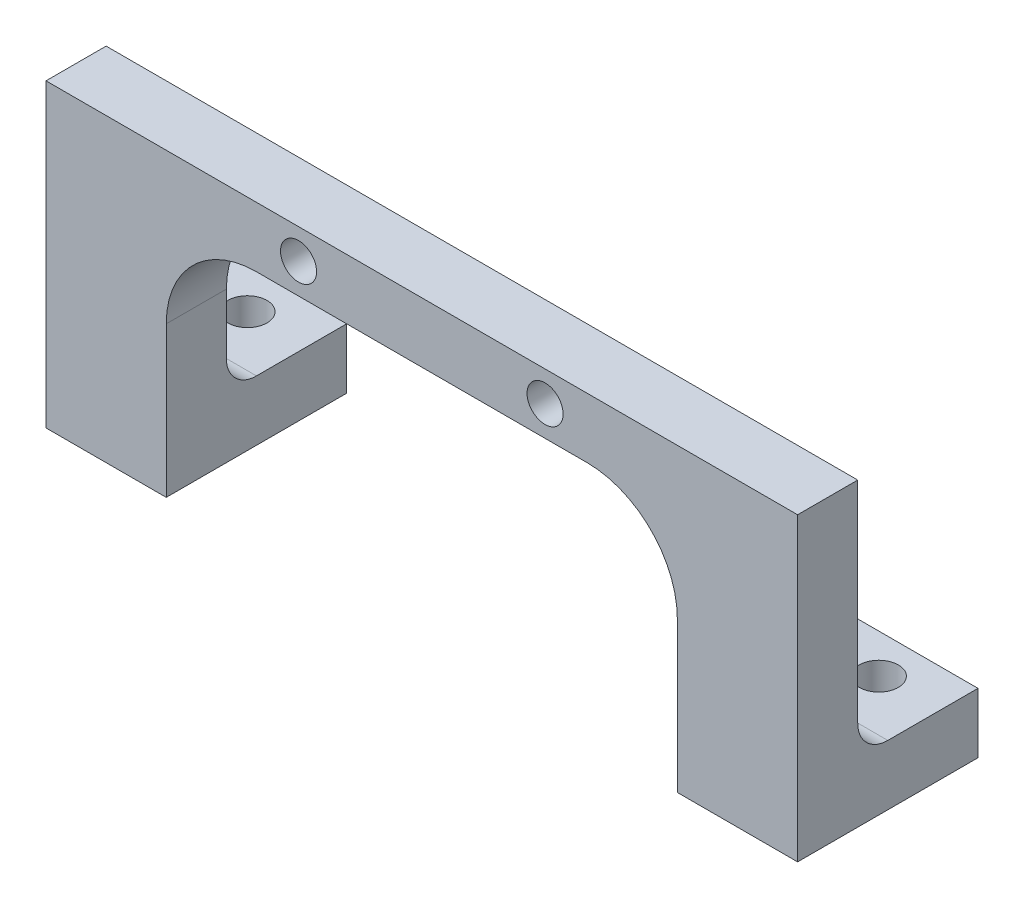
ISO-10303-21;
HEADER;
FILE_DESCRIPTION(('STEP AP214'),'2;1');
FILE_NAME('part.step','',(''),(''),'','','');
FILE_SCHEMA(('AUTOMOTIVE_DESIGN { 1 0 10303 214 1 1 1 1 }'));
ENDSEC;
DATA;
#1=APPLICATION_CONTEXT('core data for automotive mechanical design processes');
#2=APPLICATION_PROTOCOL_DEFINITION('international standard','automotive_design',2000,#1);
#3=PRODUCT_CONTEXT('',#1,'mechanical');
#4=PRODUCT('Part','Part','',(#3));
#5=PRODUCT_RELATED_PRODUCT_CATEGORY('part','',(#4));
#6=PRODUCT_DEFINITION_FORMATION('','',#4);
#7=PRODUCT_DEFINITION_CONTEXT('part definition',#1,'design');
#8=PRODUCT_DEFINITION('design','',#6,#7);
#9=PRODUCT_DEFINITION_SHAPE('','',#8);
#10=(LENGTH_UNIT() NAMED_UNIT(*) SI_UNIT(.MILLI.,.METRE.));
#11=(NAMED_UNIT(*) PLANE_ANGLE_UNIT() SI_UNIT($,.RADIAN.));
#12=(NAMED_UNIT(*) SI_UNIT($,.STERADIAN.) SOLID_ANGLE_UNIT());
#13=UNCERTAINTY_MEASURE_WITH_UNIT(LENGTH_MEASURE(1.E-05),#10,'distance_accuracy_value','');
#14=(GEOMETRIC_REPRESENTATION_CONTEXT(3) GLOBAL_UNCERTAINTY_ASSIGNED_CONTEXT((#13)) GLOBAL_UNIT_ASSIGNED_CONTEXT((#10,
#11,#12)) REPRESENTATION_CONTEXT('',''));
#15=CARTESIAN_POINT('',(0.,0.,0.));
#16=DIRECTION('',(0.,0.,1.));
#17=DIRECTION('',(1.,0.,0.));
#18=AXIS2_PLACEMENT_3D('',#15,#16,#17);
#19=CARTESIAN_POINT('',(63.5,-7.62,0.));
#20=DIRECTION('',(0.,1.,0.));
#21=DIRECTION('',(0.,0.,1.));
#22=AXIS2_PLACEMENT_3D('',#19,#20,#21);
#23=PLANE('',#22);
#24=CARTESIAN_POINT('',(58.42,-7.62,-11.5876551724138));
#25=DIRECTION('',(0.,1.,0.));
#26=DIRECTION('',(0.,0.,1.));
#27=AXIS2_PLACEMENT_3D('',#24,#25,#26);
#28=CIRCLE('',#27,1.651);
#29=CARTESIAN_POINT('',(58.42,-7.62,-9.93665517241378));
#30=VERTEX_POINT('',#29);
#31=EDGE_CURVE('E220',#30,#30,#28,.T.);
#32=ORIENTED_EDGE('',*,*,#31,.F.);
#33=EDGE_LOOP('',(#32));
#34=FACE_BOUND('',#33,.T.);
#35=DIRECTION('',(0.,0.,-1.));
#36=VECTOR('',#35,1.);
#37=CARTESIAN_POINT('',(53.34,-7.62,0.));
#38=LINE('',#37,#36);
#39=CARTESIAN_POINT('',(53.34,-7.62,-7.26965517241378));
#40=VERTEX_POINT('',#39);
#41=CARTESIAN_POINT('',(53.34,-7.62,-14.8896551724138));
#42=VERTEX_POINT('',#41);
#43=EDGE_CURVE('E222',#40,#42,#38,.T.);
#44=ORIENTED_EDGE('',*,*,#43,.F.);
#45=DIRECTION('',(-1.,0.,0.));
#46=VECTOR('',#45,1.);
#47=CARTESIAN_POINT('',(63.5,-7.62,-7.26965517241378));
#48=LINE('',#47,#46);
#49=CARTESIAN_POINT('',(63.5,-7.62,-7.26965517241378));
#50=VERTEX_POINT('',#49);
#51=EDGE_CURVE('E47',#50,#40,#48,.T.);
#52=ORIENTED_EDGE('',*,*,#51,.F.);
#53=DIRECTION('',(0.,0.,-1.));
#54=VECTOR('',#53,1.);
#55=CARTESIAN_POINT('',(63.5,-7.62,0.));
#56=LINE('',#55,#54);
#57=CARTESIAN_POINT('',(63.5,-7.62,-14.8896551724138));
#58=VERTEX_POINT('',#57);
#59=EDGE_CURVE('E168',#50,#58,#56,.T.);
#60=ORIENTED_EDGE('',*,*,#59,.T.);
#61=DIRECTION('',(-1.,0.,0.));
#62=VECTOR('',#61,1.);
#63=CARTESIAN_POINT('',(63.5,-7.62,-14.8896551724138));
#64=LINE('',#63,#62);
#65=EDGE_CURVE('E169',#58,#42,#64,.T.);
#66=ORIENTED_EDGE('',*,*,#65,.T.);
#67=EDGE_LOOP('',(#44,#52,#60,#66));
#68=FACE_BOUND('',#67,.T.);
#69=ADVANCED_FACE('F39',(#34,#68),#23,.T.);
#70=CARTESIAN_POINT('',(63.5,-5.08,-7.26965517241378));
#71=DIRECTION('',(-1.,0.,0.));
#72=DIRECTION('',(0.,0.,1.));
#73=AXIS2_PLACEMENT_3D('',#70,#71,#72);
#74=CYLINDRICAL_SURFACE('',#73,2.54);
#75=ORIENTED_EDGE('',*,*,#51,.T.);
#76=CARTESIAN_POINT('',(53.34,-5.08,-7.26965517241378));
#77=DIRECTION('',(1.,0.,0.));
#78=DIRECTION('',(0.,0.,-1.));
#79=AXIS2_PLACEMENT_3D('',#76,#77,#78);
#80=CIRCLE('',#79,2.54);
#81=CARTESIAN_POINT('',(53.34,-5.08,-4.72965517241378));
#82=VERTEX_POINT('',#81);
#83=EDGE_CURVE('E232',#40,#82,#80,.F.);
#84=ORIENTED_EDGE('',*,*,#83,.T.);
#85=DIRECTION('',(-1.,0.,0.));
#86=VECTOR('',#85,1.);
#87=CARTESIAN_POINT('',(63.5,-5.08,-4.72965517241378));
#88=LINE('',#87,#86);
#89=CARTESIAN_POINT('',(63.5,-5.08,-4.72965517241378));
#90=VERTEX_POINT('',#89);
#91=EDGE_CURVE('E178',#90,#82,#88,.T.);
#92=ORIENTED_EDGE('',*,*,#91,.F.);
#93=CARTESIAN_POINT('',(63.5,-5.08,-7.26965517241378));
#94=DIRECTION('',(1.,0.,0.));
#95=DIRECTION('',(0.,0.,-1.));
#96=AXIS2_PLACEMENT_3D('',#93,#94,#95);
#97=CIRCLE('',#96,2.54);
#98=EDGE_CURVE('E252',#50,#90,#97,.F.);
#99=ORIENTED_EDGE('',*,*,#98,.F.);
#100=EDGE_LOOP('',(#75,#84,#92,#99));
#101=FACE_BOUND('',#100,.T.);
#102=ADVANCED_FACE('F208',(#101),#74,.F.);
#103=CARTESIAN_POINT('',(63.5,-12.7,0.));
#104=DIRECTION('',(0.,1.,0.));
#105=DIRECTION('',(0.,0.,1.));
#106=AXIS2_PLACEMENT_3D('',#103,#104,#105);
#107=PLANE('',#106);
#108=CARTESIAN_POINT('',(58.42,-12.7,-11.5876551724138));
#109=DIRECTION('',(0.,1.,0.));
#110=DIRECTION('',(0.,0.,1.));
#111=AXIS2_PLACEMENT_3D('',#108,#109,#110);
#112=CIRCLE('',#111,1.651);
#113=CARTESIAN_POINT('',(58.42,-12.7,-9.93665517241378));
#114=VERTEX_POINT('',#113);
#115=EDGE_CURVE('E566',#114,#114,#112,.T.);
#116=ORIENTED_EDGE('',*,*,#115,.T.);
#117=EDGE_LOOP('',(#116));
#118=FACE_BOUND('',#117,.T.);
#119=DIRECTION('',(-1.,0.,0.));
#120=VECTOR('',#119,1.);
#121=CARTESIAN_POINT('',(63.5,-12.7,0.350344827586219));
#122=LINE('',#121,#120);
#123=CARTESIAN_POINT('',(63.5,-12.7,0.350344827586219));
#124=VERTEX_POINT('',#123);
#125=CARTESIAN_POINT('',(53.34,-12.7,0.350344827586221));
#126=VERTEX_POINT('',#125);
#127=EDGE_CURVE('E129',#124,#126,#122,.T.);
#128=ORIENTED_EDGE('',*,*,#127,.T.);
#129=DIRECTION('',(0.,0.,1.));
#130=VECTOR('',#129,1.);
#131=CARTESIAN_POINT('',(53.34,-12.7,-14.8896551724138));
#132=LINE('',#131,#130);
#133=CARTESIAN_POINT('',(53.34,-12.7,-14.8896551724138));
#134=VERTEX_POINT('',#133);
#135=EDGE_CURVE('E324',#134,#126,#132,.T.);
#136=ORIENTED_EDGE('',*,*,#135,.F.);
#137=DIRECTION('',(-1.,0.,0.));
#138=VECTOR('',#137,1.);
#139=CARTESIAN_POINT('',(63.5,-12.7,-14.8896551724138));
#140=LINE('',#139,#138);
#141=CARTESIAN_POINT('',(63.5,-12.7,-14.8896551724138));
#142=VERTEX_POINT('',#141);
#143=EDGE_CURVE('E142',#142,#134,#140,.T.);
#144=ORIENTED_EDGE('',*,*,#143,.F.);
#145=DIRECTION('',(0.,0.,-1.));
#146=VECTOR('',#145,1.);
#147=CARTESIAN_POINT('',(63.5,-12.7,0.));
#148=LINE('',#147,#146);
#149=EDGE_CURVE('E120',#124,#142,#148,.T.);
#150=ORIENTED_EDGE('',*,*,#149,.F.);
#151=EDGE_LOOP('',(#128,#136,#144,#150));
#152=FACE_BOUND('',#151,.T.);
#153=ADVANCED_FACE('F140',(#118,#152),#107,.F.);
#154=CARTESIAN_POINT('',(63.5,0.,-14.8896551724138));
#155=DIRECTION('',(0.,0.,1.));
#156=DIRECTION('',(0.,-1.,0.));
#157=AXIS2_PLACEMENT_3D('',#154,#155,#156);
#158=PLANE('',#157);
#159=ORIENTED_EDGE('',*,*,#143,.T.);
#160=DIRECTION('',(0.,1.,0.));
#161=VECTOR('',#160,1.);
#162=CARTESIAN_POINT('',(53.34,0.,-14.8896551724138));
#163=LINE('',#162,#161);
#164=EDGE_CURVE('E334',#134,#42,#163,.T.);
#165=ORIENTED_EDGE('',*,*,#164,.T.);
#166=ORIENTED_EDGE('',*,*,#65,.F.);
#167=DIRECTION('',(0.,1.,0.));
#168=VECTOR('',#167,1.);
#169=CARTESIAN_POINT('',(63.5,0.,-14.8896551724138));
#170=LINE('',#169,#168);
#171=EDGE_CURVE('E62',#142,#58,#170,.T.);
#172=ORIENTED_EDGE('',*,*,#171,.F.);
#173=EDGE_LOOP('',(#159,#165,#166,#172));
#174=FACE_BOUND('',#173,.T.);
#175=ADVANCED_FACE('F201',(#174),#158,.F.);
#176=CARTESIAN_POINT('',(5.08,-7.62,-11.5876551724138));
#177=DIRECTION('',(0.,1.,0.));
#178=DIRECTION('',(0.,0.,1.));
#179=AXIS2_PLACEMENT_3D('',#176,#177,#178);
#180=CIRCLE('',#179,1.651);
#181=CARTESIAN_POINT('',(5.08,-7.62,-9.93665517241378));
#182=VERTEX_POINT('',#181);
#183=EDGE_CURVE('E568',#182,#182,#180,.T.);
#184=ORIENTED_EDGE('',*,*,#183,.F.);
#185=EDGE_LOOP('',(#184));
#186=FACE_BOUND('',#185,.T.);
#187=DIRECTION('',(0.,0.,1.));
#188=VECTOR('',#187,1.);
#189=CARTESIAN_POINT('',(10.16,-7.62,0.));
#190=LINE('',#189,#188);
#191=CARTESIAN_POINT('',(10.16,-7.62,-14.8896551724138));
#192=VERTEX_POINT('',#191);
#193=CARTESIAN_POINT('',(10.16,-7.62,-7.26965517241378));
#194=VERTEX_POINT('',#193);
#195=EDGE_CURVE('E199',#192,#194,#190,.T.);
#196=ORIENTED_EDGE('',*,*,#195,.F.);
#197=CARTESIAN_POINT('',(0.,-7.62,-14.8896551724138));
#198=VERTEX_POINT('',#197);
#199=EDGE_CURVE('E93',#192,#198,#64,.T.);
#200=ORIENTED_EDGE('',*,*,#199,.T.);
#201=DIRECTION('',(0.,0.,-1.));
#202=VECTOR('',#201,1.);
#203=CARTESIAN_POINT('',(0.,-7.62,0.));
#204=LINE('',#203,#202);
#205=CARTESIAN_POINT('',(0.,-7.62,-7.26965517241378));
#206=VERTEX_POINT('',#205);
#207=EDGE_CURVE('E147',#206,#198,#204,.T.);
#208=ORIENTED_EDGE('',*,*,#207,.F.);
#209=EDGE_CURVE('E180',#194,#206,#48,.T.);
#210=ORIENTED_EDGE('',*,*,#209,.F.);
#211=EDGE_LOOP('',(#196,#200,#208,#210));
#212=FACE_BOUND('',#211,.T.);
#213=ADVANCED_FACE('F41',(#186,#212),#23,.T.);
#214=CARTESIAN_POINT('',(10.16,-5.08,-4.72965517241378));
#215=VERTEX_POINT('',#214);
#216=CARTESIAN_POINT('',(0.,-5.08,-4.72965517241378));
#217=VERTEX_POINT('',#216);
#218=EDGE_CURVE('E177',#215,#217,#88,.T.);
#219=ORIENTED_EDGE('',*,*,#218,.F.);
#220=CARTESIAN_POINT('',(10.16,-5.08,-7.26965517241378));
#221=DIRECTION('',(-1.,0.,0.));
#222=DIRECTION('',(0.,0.,1.));
#223=AXIS2_PLACEMENT_3D('',#220,#221,#222);
#224=CIRCLE('',#223,2.54);
#225=EDGE_CURVE('E192',#215,#194,#224,.F.);
#226=ORIENTED_EDGE('',*,*,#225,.T.);
#227=ORIENTED_EDGE('',*,*,#209,.T.);
#228=CARTESIAN_POINT('',(0.,-5.08,-7.26965517241378));
#229=DIRECTION('',(1.,0.,0.));
#230=DIRECTION('',(0.,0.,-1.));
#231=AXIS2_PLACEMENT_3D('',#228,#229,#230);
#232=CIRCLE('',#231,2.54);
#233=EDGE_CURVE('E150',#206,#217,#232,.F.);
#234=ORIENTED_EDGE('',*,*,#233,.T.);
#235=EDGE_LOOP('',(#219,#226,#227,#234));
#236=FACE_BOUND('',#235,.T.);
#237=ADVANCED_FACE('F189',(#236),#74,.F.);
#238=CARTESIAN_POINT('',(63.5,0.,-4.72965517241378));
#239=DIRECTION('',(0.,0.,-1.));
#240=DIRECTION('',(0.,1.,0.));
#241=AXIS2_PLACEMENT_3D('',#238,#239,#240);
#242=PLANE('',#241);
#243=DIRECTION('',(0.,-1.,0.));
#244=VECTOR('',#243,1.);
#245=CARTESIAN_POINT('',(53.34,0.,-4.72965517241378));
#246=LINE('',#245,#244);
#247=CARTESIAN_POINT('',(53.34,0.,-4.72965517241378));
#248=VERTEX_POINT('',#247);
#249=EDGE_CURVE('E237',#248,#82,#246,.T.);
#250=ORIENTED_EDGE('',*,*,#249,.F.);
#251=CARTESIAN_POINT('',(45.72,0.,-4.72965517241378));
#252=DIRECTION('',(0.,0.,-1.));
#253=DIRECTION('',(0.,1.,0.));
#254=AXIS2_PLACEMENT_3D('',#251,#252,#253);
#255=CIRCLE('',#254,7.62);
#256=CARTESIAN_POINT('',(45.72,7.62000000000001,-4.72965517241378));
#257=VERTEX_POINT('',#256);
#258=EDGE_CURVE('E151',#257,#248,#255,.T.);
#259=ORIENTED_EDGE('',*,*,#258,.F.);
#260=DIRECTION('',(1.,0.,0.));
#261=VECTOR('',#260,1.);
#262=CARTESIAN_POINT('',(63.5,7.62000000000001,-4.72965517241378));
#263=LINE('',#262,#261);
#264=CARTESIAN_POINT('',(17.78,7.62,-4.72965517241378));
#265=VERTEX_POINT('',#264);
#266=EDGE_CURVE('E243',#265,#257,#263,.T.);
#267=ORIENTED_EDGE('',*,*,#266,.F.);
#268=CARTESIAN_POINT('',(17.78,0.,-4.72965517241378));
#269=DIRECTION('',(0.,0.,-1.));
#270=DIRECTION('',(0.,1.,0.));
#271=AXIS2_PLACEMENT_3D('',#268,#269,#270);
#272=CIRCLE('',#271,7.62);
#273=CARTESIAN_POINT('',(10.16,0.,-4.72965517241378));
#274=VERTEX_POINT('',#273);
#275=EDGE_CURVE('E246',#274,#265,#272,.T.);
#276=ORIENTED_EDGE('',*,*,#275,.F.);
#277=DIRECTION('',(0.,1.,0.));
#278=VECTOR('',#277,1.);
#279=CARTESIAN_POINT('',(10.16,0.,-4.72965517241378));
#280=LINE('',#279,#278);
#281=EDGE_CURVE('E323',#215,#274,#280,.T.);
#282=ORIENTED_EDGE('',*,*,#281,.F.);
#283=ORIENTED_EDGE('',*,*,#218,.T.);
#284=DIRECTION('',(0.,-1.,0.));
#285=VECTOR('',#284,1.);
#286=CARTESIAN_POINT('',(0.,0.,-4.72965517241378));
#287=LINE('',#286,#285);
#288=CARTESIAN_POINT('',(0.,12.7,-4.72965517241378));
#289=VERTEX_POINT('',#288);
#290=EDGE_CURVE('E154',#289,#217,#287,.T.);
#291=ORIENTED_EDGE('',*,*,#290,.F.);
#292=DIRECTION('',(-1.,0.,0.));
#293=VECTOR('',#292,1.);
#294=CARTESIAN_POINT('',(63.5,12.7,-4.72965517241378));
#295=LINE('',#294,#293);
#296=CARTESIAN_POINT('',(63.5,12.7,-4.72965517241378));
#297=VERTEX_POINT('',#296);
#298=EDGE_CURVE('E175',#297,#289,#295,.T.);
#299=ORIENTED_EDGE('',*,*,#298,.F.);
#300=DIRECTION('',(0.,-1.,0.));
#301=VECTOR('',#300,1.);
#302=CARTESIAN_POINT('',(63.5,0.,-4.72965517241378));
#303=LINE('',#302,#301);
#304=EDGE_CURVE('E254',#297,#90,#303,.T.);
#305=ORIENTED_EDGE('',*,*,#304,.T.);
#306=ORIENTED_EDGE('',*,*,#91,.T.);
#307=EDGE_LOOP('',(#250,#259,#267,#276,#282,#283,#291,#299,#305,#306));
#308=FACE_BOUND('',#307,.T.);
#309=CARTESIAN_POINT('',(21.336,10.16,-4.72965517241378));
#310=DIRECTION('',(0.,0.,-1.));
#311=DIRECTION('',(0.,1.,0.));
#312=AXIS2_PLACEMENT_3D('',#309,#310,#311);
#313=CIRCLE('',#312,1.52399999999999);
#314=CARTESIAN_POINT('',(21.336,11.684,-4.72965517241378));
#315=VERTEX_POINT('',#314);
#316=EDGE_CURVE('E235',#315,#315,#313,.T.);
#317=ORIENTED_EDGE('',*,*,#316,.F.);
#318=EDGE_LOOP('',(#317));
#319=FACE_BOUND('',#318,.T.);
#320=CARTESIAN_POINT('',(42.164,10.16,-4.72965517241378));
#321=DIRECTION('',(0.,0.,-1.));
#322=DIRECTION('',(0.,1.,0.));
#323=AXIS2_PLACEMENT_3D('',#320,#321,#322);
#324=CIRCLE('',#323,1.52399999999999);
#325=CARTESIAN_POINT('',(42.164,11.684,-4.72965517241378));
#326=VERTEX_POINT('',#325);
#327=EDGE_CURVE('E231',#326,#326,#324,.T.);
#328=ORIENTED_EDGE('',*,*,#327,.F.);
#329=EDGE_LOOP('',(#328));
#330=FACE_BOUND('',#329,.T.);
#331=ADVANCED_FACE('F207',(#308,#319,#330),#242,.T.);
#332=CARTESIAN_POINT('',(63.5,12.7,0.));
#333=DIRECTION('',(0.,1.,0.));
#334=DIRECTION('',(0.,0.,1.));
#335=AXIS2_PLACEMENT_3D('',#332,#333,#334);
#336=PLANE('',#335);
#337=DIRECTION('',(0.,0.,-1.));
#338=VECTOR('',#337,1.);
#339=CARTESIAN_POINT('',(0.,12.7,0.));
#340=LINE('',#339,#338);
#341=CARTESIAN_POINT('',(0.,12.7,0.350344827586222));
#342=VERTEX_POINT('',#341);
#343=EDGE_CURVE('E157',#342,#289,#340,.T.);
#344=ORIENTED_EDGE('',*,*,#343,.F.);
#345=DIRECTION('',(-1.,0.,0.));
#346=VECTOR('',#345,1.);
#347=CARTESIAN_POINT('',(63.5,12.7,0.350344827586222));
#348=LINE('',#347,#346);
#349=CARTESIAN_POINT('',(63.5,12.7,0.350344827586222));
#350=VERTEX_POINT('',#349);
#351=EDGE_CURVE('E137',#350,#342,#348,.T.);
#352=ORIENTED_EDGE('',*,*,#351,.F.);
#353=DIRECTION('',(0.,0.,-1.));
#354=VECTOR('',#353,1.);
#355=CARTESIAN_POINT('',(63.5,12.7,0.));
#356=LINE('',#355,#354);
#357=EDGE_CURVE('E124',#350,#297,#356,.T.);
#358=ORIENTED_EDGE('',*,*,#357,.T.);
#359=ORIENTED_EDGE('',*,*,#298,.T.);
#360=EDGE_LOOP('',(#344,#352,#358,#359));
#361=FACE_BOUND('',#360,.T.);
#362=ADVANCED_FACE('F258',(#361),#336,.T.);
#363=CARTESIAN_POINT('',(63.5,0.,0.350344827586221));
#364=DIRECTION('',(0.,0.,-1.));
#365=DIRECTION('',(0.,1.,0.));
#366=AXIS2_PLACEMENT_3D('',#363,#364,#365);
#367=PLANE('',#366);
#368=CARTESIAN_POINT('',(21.336,10.16,0.350344827586221));
#369=DIRECTION('',(0.,0.,1.));
#370=DIRECTION('',(1.,0.,0.));
#371=AXIS2_PLACEMENT_3D('',#368,#369,#370);
#372=CIRCLE('',#371,1.52399999999999);
#373=CARTESIAN_POINT('',(22.86,10.16,0.350344827586221));
#374=VERTEX_POINT('',#373);
#375=EDGE_CURVE('E335',#374,#374,#372,.T.);
#376=ORIENTED_EDGE('',*,*,#375,.F.);
#377=EDGE_LOOP('',(#376));
#378=FACE_BOUND('',#377,.T.);
#379=CARTESIAN_POINT('',(42.164,10.16,0.350344827586221));
#380=DIRECTION('',(0.,0.,1.));
#381=DIRECTION('',(1.,0.,0.));
#382=AXIS2_PLACEMENT_3D('',#379,#380,#381);
#383=CIRCLE('',#382,1.52399999999999);
#384=CARTESIAN_POINT('',(43.688,10.16,0.350344827586221));
#385=VERTEX_POINT('',#384);
#386=EDGE_CURVE('E339',#385,#385,#383,.T.);
#387=ORIENTED_EDGE('',*,*,#386,.F.);
#388=EDGE_LOOP('',(#387));
#389=FACE_BOUND('',#388,.T.);
#390=CARTESIAN_POINT('',(45.72,0.,0.350344827586221));
#391=DIRECTION('',(0.,0.,1.));
#392=DIRECTION('',(1.,0.,0.));
#393=AXIS2_PLACEMENT_3D('',#390,#391,#392);
#394=CIRCLE('',#393,7.62);
#395=CARTESIAN_POINT('',(53.34,0.,0.350344827586221));
#396=VERTEX_POINT('',#395);
#397=CARTESIAN_POINT('',(45.72,7.62000000000001,0.350344827586221));
#398=VERTEX_POINT('',#397);
#399=EDGE_CURVE('E338',#396,#398,#394,.T.);
#400=ORIENTED_EDGE('',*,*,#399,.F.);
#401=DIRECTION('',(0.,1.,0.));
#402=VECTOR('',#401,1.);
#403=CARTESIAN_POINT('',(53.34,0.,0.350344827586221));
#404=LINE('',#403,#402);
#405=EDGE_CURVE('E134',#126,#396,#404,.T.);
#406=ORIENTED_EDGE('',*,*,#405,.F.);
#407=ORIENTED_EDGE('',*,*,#127,.F.);
#408=DIRECTION('',(0.,-1.,0.));
#409=VECTOR('',#408,1.);
#410=CARTESIAN_POINT('',(63.5,0.,0.350344827586221));
#411=LINE('',#410,#409);
#412=EDGE_CURVE('E116',#350,#124,#411,.T.);
#413=ORIENTED_EDGE('',*,*,#412,.F.);
#414=ORIENTED_EDGE('',*,*,#351,.T.);
#415=DIRECTION('',(0.,-1.,0.));
#416=VECTOR('',#415,1.);
#417=CARTESIAN_POINT('',(0.,0.,0.350344827586221));
#418=LINE('',#417,#416);
#419=CARTESIAN_POINT('',(0.,-12.7,0.350344827586219));
#420=VERTEX_POINT('',#419);
#421=EDGE_CURVE('E160',#342,#420,#418,.T.);
#422=ORIENTED_EDGE('',*,*,#421,.T.);
#423=CARTESIAN_POINT('',(10.16,-12.7,0.350344827586221));
#424=VERTEX_POINT('',#423);
#425=EDGE_CURVE('E138',#424,#420,#122,.T.);
#426=ORIENTED_EDGE('',*,*,#425,.F.);
#427=DIRECTION('',(0.,-1.,0.));
#428=VECTOR('',#427,1.);
#429=CARTESIAN_POINT('',(10.16,0.,0.350344827586221));
#430=LINE('',#429,#428);
#431=CARTESIAN_POINT('',(10.16,0.,0.350344827586221));
#432=VERTEX_POINT('',#431);
#433=EDGE_CURVE('E269',#432,#424,#430,.T.);
#434=ORIENTED_EDGE('',*,*,#433,.F.);
#435=CARTESIAN_POINT('',(17.78,0.,0.350344827586221));
#436=DIRECTION('',(0.,0.,1.));
#437=DIRECTION('',(1.,0.,0.));
#438=AXIS2_PLACEMENT_3D('',#435,#436,#437);
#439=CIRCLE('',#438,7.62);
#440=CARTESIAN_POINT('',(17.78,7.62,0.350344827586221));
#441=VERTEX_POINT('',#440);
#442=EDGE_CURVE('E575',#441,#432,#439,.T.);
#443=ORIENTED_EDGE('',*,*,#442,.F.);
#444=DIRECTION('',(-1.,0.,0.));
#445=VECTOR('',#444,1.);
#446=CARTESIAN_POINT('',(17.78,7.62,0.350344827586221));
#447=LINE('',#446,#445);
#448=EDGE_CURVE('E311',#398,#441,#447,.T.);
#449=ORIENTED_EDGE('',*,*,#448,.F.);
#450=EDGE_LOOP('',(#400,#406,#407,#413,#414,#422,#426,#434,#443,#449));
#451=FACE_BOUND('',#450,.T.);
#452=ADVANCED_FACE('F131',(#378,#389,#451),#367,.F.);
#453=CARTESIAN_POINT('',(5.08,-12.7,-11.5876551724138));
#454=DIRECTION('',(0.,1.,0.));
#455=DIRECTION('',(0.,0.,1.));
#456=AXIS2_PLACEMENT_3D('',#453,#454,#455);
#457=CIRCLE('',#456,1.651);
#458=CARTESIAN_POINT('',(5.08,-12.7,-9.93665517241378));
#459=VERTEX_POINT('',#458);
#460=EDGE_CURVE('E341',#459,#459,#457,.T.);
#461=ORIENTED_EDGE('',*,*,#460,.T.);
#462=EDGE_LOOP('',(#461));
#463=FACE_BOUND('',#462,.T.);
#464=CARTESIAN_POINT('',(10.16,-12.7,-14.8896551724138));
#465=VERTEX_POINT('',#464);
#466=CARTESIAN_POINT('',(0.,-12.7,-14.8896551724138));
#467=VERTEX_POINT('',#466);
#468=EDGE_CURVE('E172',#465,#467,#140,.T.);
#469=ORIENTED_EDGE('',*,*,#468,.F.);
#470=DIRECTION('',(0.,0.,1.));
#471=VECTOR('',#470,1.);
#472=CARTESIAN_POINT('',(10.16,-12.7,-14.8896551724138));
#473=LINE('',#472,#471);
#474=EDGE_CURVE('E54',#465,#424,#473,.T.);
#475=ORIENTED_EDGE('',*,*,#474,.T.);
#476=ORIENTED_EDGE('',*,*,#425,.T.);
#477=DIRECTION('',(0.,0.,-1.));
#478=VECTOR('',#477,1.);
#479=CARTESIAN_POINT('',(0.,-12.7,0.));
#480=LINE('',#479,#478);
#481=EDGE_CURVE('E163',#420,#467,#480,.T.);
#482=ORIENTED_EDGE('',*,*,#481,.T.);
#483=EDGE_LOOP('',(#469,#475,#476,#482));
#484=FACE_BOUND('',#483,.T.);
#485=ADVANCED_FACE('F264',(#463,#484),#107,.F.);
#486=ORIENTED_EDGE('',*,*,#199,.F.);
#487=DIRECTION('',(0.,-1.,0.));
#488=VECTOR('',#487,1.);
#489=CARTESIAN_POINT('',(10.16,0.,-14.8896551724138));
#490=LINE('',#489,#488);
#491=EDGE_CURVE('E11',#192,#465,#490,.T.);
#492=ORIENTED_EDGE('',*,*,#491,.T.);
#493=ORIENTED_EDGE('',*,*,#468,.T.);
#494=DIRECTION('',(0.,1.,0.));
#495=VECTOR('',#494,1.);
#496=CARTESIAN_POINT('',(0.,0.,-14.8896551724138));
#497=LINE('',#496,#495);
#498=EDGE_CURVE('E166',#467,#198,#497,.T.);
#499=ORIENTED_EDGE('',*,*,#498,.T.);
#500=EDGE_LOOP('',(#486,#492,#493,#499));
#501=FACE_BOUND('',#500,.T.);
#502=ADVANCED_FACE('F211',(#501),#158,.F.);
#503=CARTESIAN_POINT('',(63.5,0.,0.));
#504=DIRECTION('',(1.,0.,0.));
#505=DIRECTION('',(0.,0.,-1.));
#506=AXIS2_PLACEMENT_3D('',#503,#504,#505);
#507=PLANE('',#506);
#508=ORIENTED_EDGE('',*,*,#59,.F.);
#509=ORIENTED_EDGE('',*,*,#98,.T.);
#510=ORIENTED_EDGE('',*,*,#304,.F.);
#511=ORIENTED_EDGE('',*,*,#357,.F.);
#512=ORIENTED_EDGE('',*,*,#412,.T.);
#513=ORIENTED_EDGE('',*,*,#149,.T.);
#514=ORIENTED_EDGE('',*,*,#171,.T.);
#515=EDGE_LOOP('',(#508,#509,#510,#511,#512,#513,#514));
#516=FACE_BOUND('',#515,.T.);
#517=ADVANCED_FACE('F118',(#516),#507,.T.);
#518=CARTESIAN_POINT('',(0.,0.,0.));
#519=DIRECTION('',(1.,0.,0.));
#520=DIRECTION('',(0.,0.,-1.));
#521=AXIS2_PLACEMENT_3D('',#518,#519,#520);
#522=PLANE('',#521);
#523=ORIENTED_EDGE('',*,*,#207,.T.);
#524=ORIENTED_EDGE('',*,*,#498,.F.);
#525=ORIENTED_EDGE('',*,*,#481,.F.);
#526=ORIENTED_EDGE('',*,*,#421,.F.);
#527=ORIENTED_EDGE('',*,*,#343,.T.);
#528=ORIENTED_EDGE('',*,*,#290,.T.);
#529=ORIENTED_EDGE('',*,*,#233,.F.);
#530=EDGE_LOOP('',(#523,#524,#525,#526,#527,#528,#529));
#531=FACE_BOUND('',#530,.T.);
#532=ADVANCED_FACE('F194',(#531),#522,.F.);
#533=CARTESIAN_POINT('',(45.72,0.,-14.8896551724138));
#534=DIRECTION('',(0.,0.,1.));
#535=DIRECTION('',(1.,0.,0.));
#536=AXIS2_PLACEMENT_3D('',#533,#534,#535);
#537=CYLINDRICAL_SURFACE('',#536,7.62);
#538=ORIENTED_EDGE('',*,*,#258,.T.);
#539=DIRECTION('',(0.,0.,1.));
#540=VECTOR('',#539,1.);
#541=CARTESIAN_POINT('',(53.34,0.,-14.8896551724138));
#542=LINE('',#541,#540);
#543=EDGE_CURVE('E321',#248,#396,#542,.T.);
#544=ORIENTED_EDGE('',*,*,#543,.T.);
#545=ORIENTED_EDGE('',*,*,#399,.T.);
#546=DIRECTION('',(0.,0.,1.));
#547=VECTOR('',#546,1.);
#548=CARTESIAN_POINT('',(45.72,7.62000000000001,-14.8896551724138));
#549=LINE('',#548,#547);
#550=EDGE_CURVE('E312',#257,#398,#549,.T.);
#551=ORIENTED_EDGE('',*,*,#550,.F.);
#552=EDGE_LOOP('',(#538,#544,#545,#551));
#553=FACE_BOUND('',#552,.T.);
#554=ADVANCED_FACE('F319',(#553),#537,.F.);
#555=CARTESIAN_POINT('',(53.34,0.,-14.8896551724138));
#556=DIRECTION('',(1.,0.,0.));
#557=DIRECTION('',(0.,0.,-1.));
#558=AXIS2_PLACEMENT_3D('',#555,#556,#557);
#559=PLANE('',#558);
#560=ORIENTED_EDGE('',*,*,#43,.T.);
#561=ORIENTED_EDGE('',*,*,#164,.F.);
#562=ORIENTED_EDGE('',*,*,#135,.T.);
#563=ORIENTED_EDGE('',*,*,#405,.T.);
#564=ORIENTED_EDGE('',*,*,#543,.F.);
#565=ORIENTED_EDGE('',*,*,#249,.T.);
#566=ORIENTED_EDGE('',*,*,#83,.F.);
#567=EDGE_LOOP('',(#560,#561,#562,#563,#564,#565,#566));
#568=FACE_BOUND('',#567,.T.);
#569=ADVANCED_FACE('F322',(#568),#559,.F.);
#570=CARTESIAN_POINT('',(10.16,0.,-14.8896551724138));
#571=DIRECTION('',(-1.,0.,0.));
#572=DIRECTION('',(0.,0.,1.));
#573=AXIS2_PLACEMENT_3D('',#570,#571,#572);
#574=PLANE('',#573);
#575=ORIENTED_EDGE('',*,*,#195,.T.);
#576=ORIENTED_EDGE('',*,*,#225,.F.);
#577=ORIENTED_EDGE('',*,*,#281,.T.);
#578=DIRECTION('',(0.,0.,1.));
#579=VECTOR('',#578,1.);
#580=CARTESIAN_POINT('',(10.16,0.,-14.8896551724138));
#581=LINE('',#580,#579);
#582=EDGE_CURVE('E306',#274,#432,#581,.T.);
#583=ORIENTED_EDGE('',*,*,#582,.T.);
#584=ORIENTED_EDGE('',*,*,#433,.T.);
#585=ORIENTED_EDGE('',*,*,#474,.F.);
#586=ORIENTED_EDGE('',*,*,#491,.F.);
#587=EDGE_LOOP('',(#575,#576,#577,#583,#584,#585,#586));
#588=FACE_BOUND('',#587,.T.);
#589=ADVANCED_FACE('F344',(#588),#574,.F.);
#590=CARTESIAN_POINT('',(17.78,0.,-14.8896551724138));
#591=DIRECTION('',(0.,0.,1.));
#592=DIRECTION('',(1.,0.,0.));
#593=AXIS2_PLACEMENT_3D('',#590,#591,#592);
#594=CYLINDRICAL_SURFACE('',#593,7.62);
#595=ORIENTED_EDGE('',*,*,#275,.T.);
#596=DIRECTION('',(0.,0.,1.));
#597=VECTOR('',#596,1.);
#598=CARTESIAN_POINT('',(17.78,7.62,-14.8896551724138));
#599=LINE('',#598,#597);
#600=EDGE_CURVE('E304',#265,#441,#599,.T.);
#601=ORIENTED_EDGE('',*,*,#600,.T.);
#602=ORIENTED_EDGE('',*,*,#442,.T.);
#603=ORIENTED_EDGE('',*,*,#582,.F.);
#604=EDGE_LOOP('',(#595,#601,#602,#603));
#605=FACE_BOUND('',#604,.T.);
#606=ADVANCED_FACE('F302',(#605),#594,.F.);
#607=CARTESIAN_POINT('',(17.78,7.62,-14.8896551724138));
#608=DIRECTION('',(0.,1.,0.));
#609=DIRECTION('',(-1.,0.,0.));
#610=AXIS2_PLACEMENT_3D('',#607,#608,#609);
#611=PLANE('',#610);
#612=ORIENTED_EDGE('',*,*,#266,.T.);
#613=ORIENTED_EDGE('',*,*,#550,.T.);
#614=ORIENTED_EDGE('',*,*,#448,.T.);
#615=ORIENTED_EDGE('',*,*,#600,.F.);
#616=EDGE_LOOP('',(#612,#613,#614,#615));
#617=FACE_BOUND('',#616,.T.);
#618=ADVANCED_FACE('F309',(#617),#611,.F.);
#619=CARTESIAN_POINT('',(42.164,10.16,-14.8896551724138));
#620=DIRECTION('',(0.,0.,1.));
#621=DIRECTION('',(1.,0.,0.));
#622=AXIS2_PLACEMENT_3D('',#619,#620,#621);
#623=CYLINDRICAL_SURFACE('',#622,1.52399999999999);
#624=ORIENTED_EDGE('',*,*,#327,.T.);
#625=EDGE_LOOP('',(#624));
#626=FACE_BOUND('',#625,.T.);
#627=ORIENTED_EDGE('',*,*,#386,.T.);
#628=EDGE_LOOP('',(#627));
#629=FACE_BOUND('',#628,.T.);
#630=ADVANCED_FACE('F418',(#626,#629),#623,.F.);
#631=CARTESIAN_POINT('',(21.336,10.16,-14.8896551724138));
#632=DIRECTION('',(0.,0.,1.));
#633=DIRECTION('',(1.,0.,0.));
#634=AXIS2_PLACEMENT_3D('',#631,#632,#633);
#635=CYLINDRICAL_SURFACE('',#634,1.52399999999999);
#636=ORIENTED_EDGE('',*,*,#316,.T.);
#637=EDGE_LOOP('',(#636));
#638=FACE_BOUND('',#637,.T.);
#639=ORIENTED_EDGE('',*,*,#375,.T.);
#640=EDGE_LOOP('',(#639));
#641=FACE_BOUND('',#640,.T.);
#642=ADVANCED_FACE('F395',(#638,#641),#635,.F.);
#643=CARTESIAN_POINT('',(5.08,-12.7,-11.5876551724138));
#644=DIRECTION('',(0.,1.,0.));
#645=DIRECTION('',(0.,0.,1.));
#646=AXIS2_PLACEMENT_3D('',#643,#644,#645);
#647=CYLINDRICAL_SURFACE('',#646,1.651);
#648=ORIENTED_EDGE('',*,*,#460,.F.);
#649=EDGE_LOOP('',(#648));
#650=FACE_BOUND('',#649,.T.);
#651=ORIENTED_EDGE('',*,*,#183,.T.);
#652=EDGE_LOOP('',(#651));
#653=FACE_BOUND('',#652,.T.);
#654=ADVANCED_FACE('F389',(#650,#653),#647,.F.);
#655=CARTESIAN_POINT('',(58.42,-12.7,-11.5876551724138));
#656=DIRECTION('',(0.,1.,0.));
#657=DIRECTION('',(0.,0.,1.));
#658=AXIS2_PLACEMENT_3D('',#655,#656,#657);
#659=CYLINDRICAL_SURFACE('',#658,1.651);
#660=ORIENTED_EDGE('',*,*,#115,.F.);
#661=EDGE_LOOP('',(#660));
#662=FACE_BOUND('',#661,.T.);
#663=ORIENTED_EDGE('',*,*,#31,.T.);
#664=EDGE_LOOP('',(#663));
#665=FACE_BOUND('',#664,.T.);
#666=ADVANCED_FACE('F394',(#662,#665),#659,.F.);
#667=CLOSED_SHELL('',(#69,#102,#153,#175,#213,#237,#331,#362,#452,#485,#502,#517,#532,#554,#569,
#589,#606,#618,#630,#642,#654,#666));
#668=MANIFOLD_SOLID_BREP('B2',#667);
#669=ADVANCED_BREP_SHAPE_REPRESENTATION('',(#18,#668),#14);
#670=SHAPE_DEFINITION_REPRESENTATION(#9,#669);
ENDSEC;
END-ISO-10303-21;
